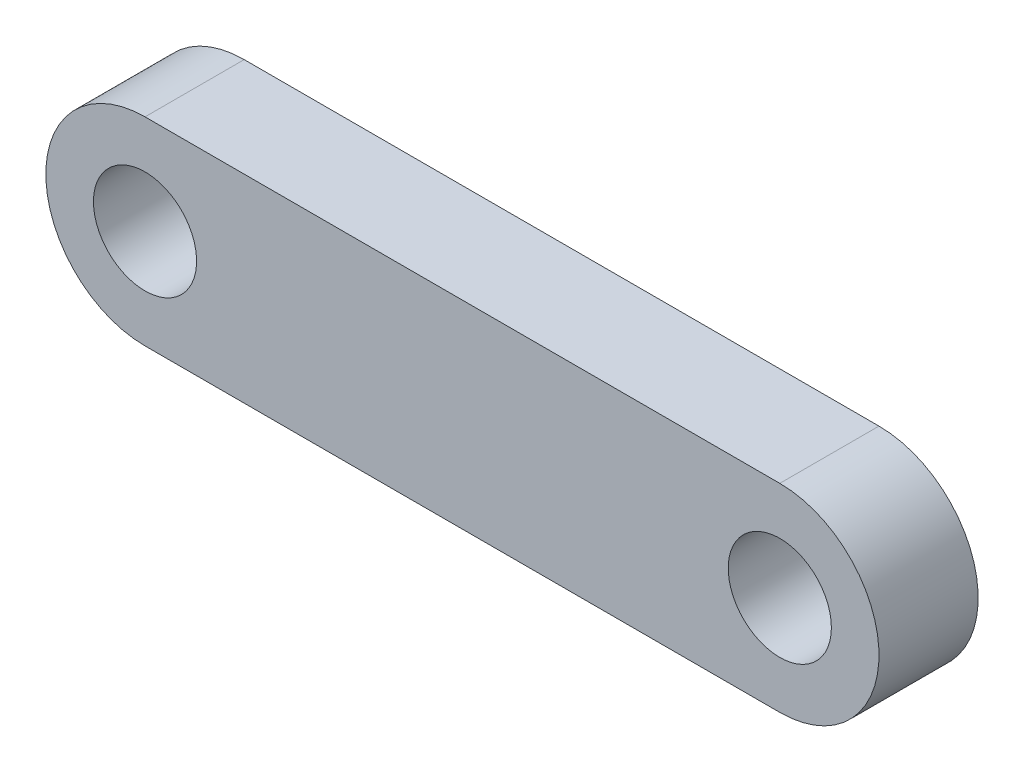
ISO-10303-21;
HEADER;
FILE_DESCRIPTION(('STEP AP214'),'2;1');
FILE_NAME('part.step','',(''),(''),'','','');
FILE_SCHEMA(('AUTOMOTIVE_DESIGN { 1 0 10303 214 1 1 1 1 }'));
ENDSEC;
DATA;
#1=APPLICATION_CONTEXT('core data for automotive mechanical design processes');
#2=APPLICATION_PROTOCOL_DEFINITION('international standard','automotive_design',2000,#1);
#3=PRODUCT_CONTEXT('',#1,'mechanical');
#4=PRODUCT('Part','Part','',(#3));
#5=PRODUCT_RELATED_PRODUCT_CATEGORY('part','',(#4));
#6=PRODUCT_DEFINITION_FORMATION('','',#4);
#7=PRODUCT_DEFINITION_CONTEXT('part definition',#1,'design');
#8=PRODUCT_DEFINITION('design','',#6,#7);
#9=PRODUCT_DEFINITION_SHAPE('','',#8);
#10=(LENGTH_UNIT() NAMED_UNIT(*) SI_UNIT(.MILLI.,.METRE.));
#11=(NAMED_UNIT(*) PLANE_ANGLE_UNIT() SI_UNIT($,.RADIAN.));
#12=(NAMED_UNIT(*) SI_UNIT($,.STERADIAN.) SOLID_ANGLE_UNIT());
#13=UNCERTAINTY_MEASURE_WITH_UNIT(LENGTH_MEASURE(1.E-05),#10,'distance_accuracy_value','');
#14=(GEOMETRIC_REPRESENTATION_CONTEXT(3) GLOBAL_UNCERTAINTY_ASSIGNED_CONTEXT((#13)) GLOBAL_UNIT_ASSIGNED_CONTEXT((#10,
#11,#12)) REPRESENTATION_CONTEXT('',''));
#15=CARTESIAN_POINT('',(0.,0.,0.));
#16=DIRECTION('',(0.,0.,1.));
#17=DIRECTION('',(1.,0.,0.));
#18=AXIS2_PLACEMENT_3D('',#15,#16,#17);
#19=CARTESIAN_POINT('',(-71.1788966961585,0.,3.175));
#20=DIRECTION('',(0.,0.,1.));
#21=DIRECTION('',(1.,0.,0.));
#22=AXIS2_PLACEMENT_3D('',#19,#20,#21);
#23=PLANE('',#22);
#24=CARTESIAN_POINT('',(-50.8588966961585,0.,3.175));
#25=DIRECTION('',(0.,0.,1.));
#26=DIRECTION('',(1.,0.,0.));
#27=AXIS2_PLACEMENT_3D('',#24,#25,#26);
#28=CIRCLE('',#27,1.651);
#29=CARTESIAN_POINT('',(-49.2078966961585,0.,3.175));
#30=VERTEX_POINT('',#29);
#31=EDGE_CURVE('E99',#30,#30,#28,.T.);
#32=ORIENTED_EDGE('',*,*,#31,.F.);
#33=EDGE_LOOP('',(#32));
#34=FACE_BOUND('',#33,.T.);
#35=CARTESIAN_POINT('',(-71.1788966961585,0.,3.175));
#36=DIRECTION('',(0.,0.,1.));
#37=DIRECTION('',(1.,0.,0.));
#38=AXIS2_PLACEMENT_3D('',#35,#36,#37);
#39=CIRCLE('',#38,3.175);
#40=CARTESIAN_POINT('',(-71.1788966961585,3.17499999999999,3.175));
#41=VERTEX_POINT('',#40);
#42=CARTESIAN_POINT('',(-71.1788966961585,-3.17500000000001,3.175));
#43=VERTEX_POINT('',#42);
#44=EDGE_CURVE('E84',#41,#43,#39,.T.);
#45=ORIENTED_EDGE('',*,*,#44,.T.);
#46=DIRECTION('',(1.,0.,0.));
#47=VECTOR('',#46,1.);
#48=CARTESIAN_POINT('',(-71.1788966961585,-3.17500000000001,3.175));
#49=LINE('',#48,#47);
#50=CARTESIAN_POINT('',(-50.8588966961586,-3.17500000000001,3.175));
#51=VERTEX_POINT('',#50);
#52=EDGE_CURVE('E79',#43,#51,#49,.T.);
#53=ORIENTED_EDGE('',*,*,#52,.T.);
#54=CARTESIAN_POINT('',(-50.8588966961585,0.,3.175));
#55=DIRECTION('',(0.,0.,1.));
#56=DIRECTION('',(-1.,0.,0.));
#57=AXIS2_PLACEMENT_3D('',#54,#55,#56);
#58=CIRCLE('',#57,3.175);
#59=CARTESIAN_POINT('',(-50.8588966961585,3.17499999999999,3.175));
#60=VERTEX_POINT('',#59);
#61=EDGE_CURVE('E82',#51,#60,#58,.T.);
#62=ORIENTED_EDGE('',*,*,#61,.T.);
#63=DIRECTION('',(-1.,0.,0.));
#64=VECTOR('',#63,1.);
#65=CARTESIAN_POINT('',(-71.1788966961585,3.17499999999999,3.175));
#66=LINE('',#65,#64);
#67=EDGE_CURVE('E49',#60,#41,#66,.T.);
#68=ORIENTED_EDGE('',*,*,#67,.T.);
#69=EDGE_LOOP('',(#45,#53,#62,#68));
#70=FACE_BOUND('',#69,.T.);
#71=CARTESIAN_POINT('',(-71.1788966961585,0.,3.175));
#72=DIRECTION('',(0.,0.,1.));
#73=DIRECTION('',(-1.,0.,0.));
#74=AXIS2_PLACEMENT_3D('',#71,#72,#73);
#75=CIRCLE('',#74,1.65099999999999);
#76=CARTESIAN_POINT('',(-72.8298966961585,0.,3.175));
#77=VERTEX_POINT('',#76);
#78=EDGE_CURVE('E114',#77,#77,#75,.T.);
#79=ORIENTED_EDGE('',*,*,#78,.F.);
#80=EDGE_LOOP('',(#79));
#81=FACE_BOUND('',#80,.T.);
#82=ADVANCED_FACE('F32',(#34,#70,#81),#23,.T.);
#83=CARTESIAN_POINT('',(-71.1788966961585,0.,0.));
#84=DIRECTION('',(0.,0.,1.));
#85=DIRECTION('',(1.,0.,0.));
#86=AXIS2_PLACEMENT_3D('',#83,#84,#85);
#87=PLANE('',#86);
#88=CARTESIAN_POINT('',(-50.8588966961585,0.,0.));
#89=DIRECTION('',(0.,0.,1.));
#90=DIRECTION('',(1.,0.,0.));
#91=AXIS2_PLACEMENT_3D('',#88,#89,#90);
#92=CIRCLE('',#91,1.651);
#93=CARTESIAN_POINT('',(-49.2078966961585,0.,0.));
#94=VERTEX_POINT('',#93);
#95=EDGE_CURVE('E111',#94,#94,#92,.T.);
#96=ORIENTED_EDGE('',*,*,#95,.T.);
#97=EDGE_LOOP('',(#96));
#98=FACE_BOUND('',#97,.T.);
#99=CARTESIAN_POINT('',(-71.1788966961585,0.,0.));
#100=DIRECTION('',(0.,0.,1.));
#101=DIRECTION('',(1.,0.,0.));
#102=AXIS2_PLACEMENT_3D('',#99,#100,#101);
#103=CIRCLE('',#102,3.175);
#104=CARTESIAN_POINT('',(-71.1788966961585,3.17499999999999,0.));
#105=VERTEX_POINT('',#104);
#106=CARTESIAN_POINT('',(-71.1788966961585,-3.17500000000001,0.));
#107=VERTEX_POINT('',#106);
#108=EDGE_CURVE('E96',#105,#107,#103,.T.);
#109=ORIENTED_EDGE('',*,*,#108,.F.);
#110=DIRECTION('',(-1.,0.,0.));
#111=VECTOR('',#110,1.);
#112=CARTESIAN_POINT('',(-71.1788966961585,3.17499999999999,0.));
#113=LINE('',#112,#111);
#114=CARTESIAN_POINT('',(-50.8588966961585,3.17499999999999,0.));
#115=VERTEX_POINT('',#114);
#116=EDGE_CURVE('E72',#115,#105,#113,.T.);
#117=ORIENTED_EDGE('',*,*,#116,.F.);
#118=CARTESIAN_POINT('',(-50.8588966961585,0.,0.));
#119=DIRECTION('',(0.,0.,1.));
#120=DIRECTION('',(-1.,0.,0.));
#121=AXIS2_PLACEMENT_3D('',#118,#119,#120);
#122=CIRCLE('',#121,3.175);
#123=CARTESIAN_POINT('',(-50.8588966961586,-3.17500000000001,0.));
#124=VERTEX_POINT('',#123);
#125=EDGE_CURVE('E66',#124,#115,#122,.T.);
#126=ORIENTED_EDGE('',*,*,#125,.F.);
#127=DIRECTION('',(1.,0.,0.));
#128=VECTOR('',#127,1.);
#129=CARTESIAN_POINT('',(-71.1788966961585,-3.17500000000001,0.));
#130=LINE('',#129,#128);
#131=EDGE_CURVE('E88',#107,#124,#130,.T.);
#132=ORIENTED_EDGE('',*,*,#131,.F.);
#133=EDGE_LOOP('',(#109,#117,#126,#132));
#134=FACE_BOUND('',#133,.T.);
#135=CARTESIAN_POINT('',(-71.1788966961585,0.,0.));
#136=DIRECTION('',(0.,0.,1.));
#137=DIRECTION('',(-1.,0.,0.));
#138=AXIS2_PLACEMENT_3D('',#135,#136,#137);
#139=CIRCLE('',#138,1.65099999999999);
#140=CARTESIAN_POINT('',(-72.8298966961585,0.,0.));
#141=VERTEX_POINT('',#140);
#142=EDGE_CURVE('E117',#141,#141,#139,.T.);
#143=ORIENTED_EDGE('',*,*,#142,.T.);
#144=EDGE_LOOP('',(#143));
#145=FACE_BOUND('',#144,.T.);
#146=ADVANCED_FACE('F107',(#98,#134,#145),#87,.F.);
#147=CARTESIAN_POINT('',(-71.1788966961585,0.,3.175));
#148=DIRECTION('',(0.,0.,-1.));
#149=DIRECTION('',(-1.,0.,0.));
#150=AXIS2_PLACEMENT_3D('',#147,#148,#149);
#151=CYLINDRICAL_SURFACE('',#150,3.175);
#152=ORIENTED_EDGE('',*,*,#108,.T.);
#153=DIRECTION('',(0.,0.,-1.));
#154=VECTOR('',#153,1.);
#155=CARTESIAN_POINT('',(-71.1788966961585,-3.17500000000001,3.175));
#156=LINE('',#155,#154);
#157=EDGE_CURVE('E11',#43,#107,#156,.T.);
#158=ORIENTED_EDGE('',*,*,#157,.F.);
#159=ORIENTED_EDGE('',*,*,#44,.F.);
#160=DIRECTION('',(0.,0.,-1.));
#161=VECTOR('',#160,1.);
#162=CARTESIAN_POINT('',(-71.1788966961585,3.17499999999999,3.175));
#163=LINE('',#162,#161);
#164=EDGE_CURVE('E92',#41,#105,#163,.T.);
#165=ORIENTED_EDGE('',*,*,#164,.T.);
#166=EDGE_LOOP('',(#152,#158,#159,#165));
#167=FACE_BOUND('',#166,.T.);
#168=ADVANCED_FACE('F34',(#167),#151,.T.);
#169=CARTESIAN_POINT('',(-71.1788966961585,-3.17500000000001,3.175));
#170=DIRECTION('',(0.,1.,0.));
#171=DIRECTION('',(-1.,0.,0.));
#172=AXIS2_PLACEMENT_3D('',#169,#170,#171);
#173=PLANE('',#172);
#174=ORIENTED_EDGE('',*,*,#131,.T.);
#175=DIRECTION('',(0.,0.,-1.));
#176=VECTOR('',#175,1.);
#177=CARTESIAN_POINT('',(-50.8588966961586,-3.17500000000001,3.175));
#178=LINE('',#177,#176);
#179=EDGE_CURVE('E41',#51,#124,#178,.T.);
#180=ORIENTED_EDGE('',*,*,#179,.F.);
#181=ORIENTED_EDGE('',*,*,#52,.F.);
#182=ORIENTED_EDGE('',*,*,#157,.T.);
#183=EDGE_LOOP('',(#174,#180,#181,#182));
#184=FACE_BOUND('',#183,.T.);
#185=ADVANCED_FACE('F87',(#184),#173,.F.);
#186=CARTESIAN_POINT('',(-50.8588966961585,0.,3.175));
#187=DIRECTION('',(0.,0.,-1.));
#188=DIRECTION('',(-1.,0.,0.));
#189=AXIS2_PLACEMENT_3D('',#186,#187,#188);
#190=CYLINDRICAL_SURFACE('',#189,3.175);
#191=ORIENTED_EDGE('',*,*,#125,.T.);
#192=DIRECTION('',(0.,0.,-1.));
#193=VECTOR('',#192,1.);
#194=CARTESIAN_POINT('',(-50.8588966961585,3.17499999999999,3.175));
#195=LINE('',#194,#193);
#196=EDGE_CURVE('E89',#60,#115,#195,.T.);
#197=ORIENTED_EDGE('',*,*,#196,.F.);
#198=ORIENTED_EDGE('',*,*,#61,.F.);
#199=ORIENTED_EDGE('',*,*,#179,.T.);
#200=EDGE_LOOP('',(#191,#197,#198,#199));
#201=FACE_BOUND('',#200,.T.);
#202=ADVANCED_FACE('F90',(#201),#190,.T.);
#203=CARTESIAN_POINT('',(-71.1788966961585,3.17499999999999,3.175));
#204=DIRECTION('',(0.,-1.,0.));
#205=DIRECTION('',(1.,0.,0.));
#206=AXIS2_PLACEMENT_3D('',#203,#204,#205);
#207=PLANE('',#206);
#208=ORIENTED_EDGE('',*,*,#116,.T.);
#209=ORIENTED_EDGE('',*,*,#164,.F.);
#210=ORIENTED_EDGE('',*,*,#67,.F.);
#211=ORIENTED_EDGE('',*,*,#196,.T.);
#212=EDGE_LOOP('',(#208,#209,#210,#211));
#213=FACE_BOUND('',#212,.T.);
#214=ADVANCED_FACE('F104',(#213),#207,.F.);
#215=CARTESIAN_POINT('',(-50.8588966961585,0.,3.175));
#216=DIRECTION('',(0.,0.,-1.));
#217=DIRECTION('',(-1.,0.,0.));
#218=AXIS2_PLACEMENT_3D('',#215,#216,#217);
#219=CYLINDRICAL_SURFACE('',#218,1.651);
#220=ORIENTED_EDGE('',*,*,#31,.T.);
#221=EDGE_LOOP('',(#220));
#222=FACE_BOUND('',#221,.T.);
#223=ORIENTED_EDGE('',*,*,#95,.F.);
#224=EDGE_LOOP('',(#223));
#225=FACE_BOUND('',#224,.T.);
#226=ADVANCED_FACE('F135',(#222,#225),#219,.F.);
#227=CARTESIAN_POINT('',(-71.1788966961585,0.,3.175));
#228=DIRECTION('',(0.,0.,-1.));
#229=DIRECTION('',(-1.,0.,0.));
#230=AXIS2_PLACEMENT_3D('',#227,#228,#229);
#231=CYLINDRICAL_SURFACE('',#230,1.65099999999999);
#232=ORIENTED_EDGE('',*,*,#78,.T.);
#233=EDGE_LOOP('',(#232));
#234=FACE_BOUND('',#233,.T.);
#235=ORIENTED_EDGE('',*,*,#142,.F.);
#236=EDGE_LOOP('',(#235));
#237=FACE_BOUND('',#236,.T.);
#238=ADVANCED_FACE('F123',(#234,#237),#231,.F.);
#239=CLOSED_SHELL('',(#82,#146,#168,#185,#202,#214,#226,#238));
#240=MANIFOLD_SOLID_BREP('B2',#239);
#241=ADVANCED_BREP_SHAPE_REPRESENTATION('',(#18,#240),#14);
#242=SHAPE_DEFINITION_REPRESENTATION(#9,#241);
ENDSEC;
END-ISO-10303-21;
